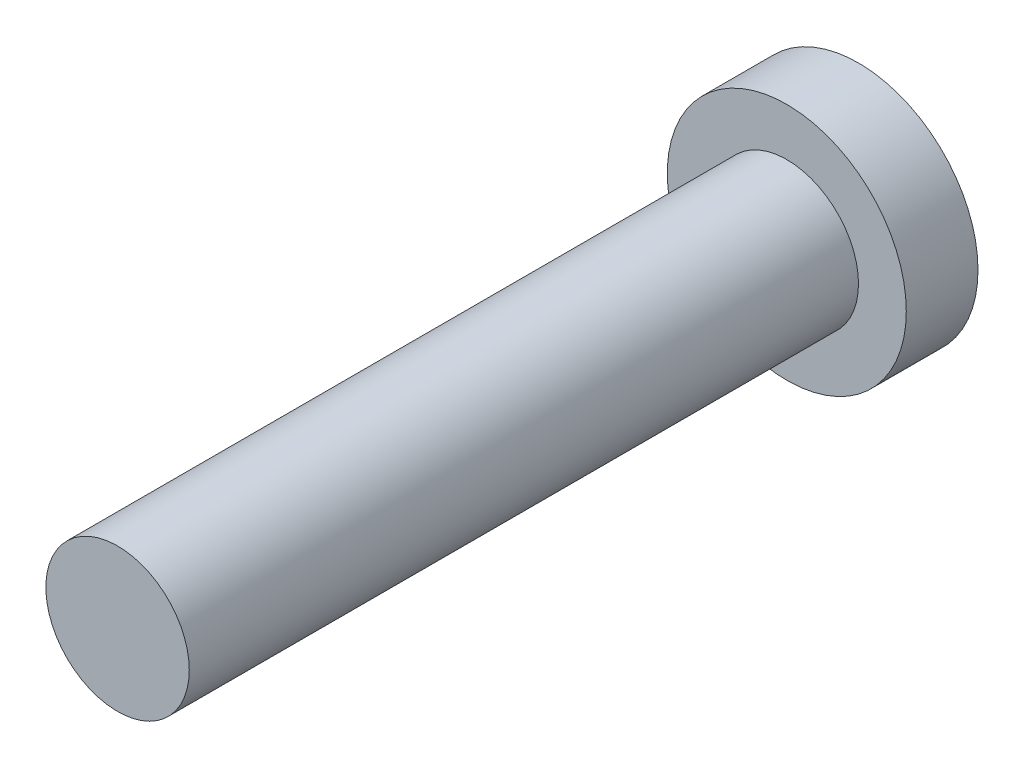
ISO-10303-21;
HEADER;
FILE_DESCRIPTION(('STEP AP214'),'2;1');
FILE_NAME('part.step','',(''),(''),'','','');
FILE_SCHEMA(('AUTOMOTIVE_DESIGN { 1 0 10303 214 1 1 1 1 }'));
ENDSEC;
DATA;
#1=APPLICATION_CONTEXT('core data for automotive mechanical design processes');
#2=APPLICATION_PROTOCOL_DEFINITION('international standard','automotive_design',2000,#1);
#3=PRODUCT_CONTEXT('',#1,'mechanical');
#4=PRODUCT('Part','Part','',(#3));
#5=PRODUCT_RELATED_PRODUCT_CATEGORY('part','',(#4));
#6=PRODUCT_DEFINITION_FORMATION('','',#4);
#7=PRODUCT_DEFINITION_CONTEXT('part definition',#1,'design');
#8=PRODUCT_DEFINITION('design','',#6,#7);
#9=PRODUCT_DEFINITION_SHAPE('','',#8);
#10=(LENGTH_UNIT() NAMED_UNIT(*) SI_UNIT(.MILLI.,.METRE.));
#11=(NAMED_UNIT(*) PLANE_ANGLE_UNIT() SI_UNIT($,.RADIAN.));
#12=(NAMED_UNIT(*) SI_UNIT($,.STERADIAN.) SOLID_ANGLE_UNIT());
#13=UNCERTAINTY_MEASURE_WITH_UNIT(LENGTH_MEASURE(1.E-05),#10,'distance_accuracy_value','');
#14=(GEOMETRIC_REPRESENTATION_CONTEXT(3) GLOBAL_UNCERTAINTY_ASSIGNED_CONTEXT((#13)) GLOBAL_UNIT_ASSIGNED_CONTEXT((#10,
#11,#12)) REPRESENTATION_CONTEXT('',''));
#15=CARTESIAN_POINT('',(0.,0.,0.));
#16=DIRECTION('',(0.,0.,1.));
#17=DIRECTION('',(1.,0.,0.));
#18=AXIS2_PLACEMENT_3D('',#15,#16,#17);
#19=CARTESIAN_POINT('',(0.,0.,1.5));
#20=DIRECTION('',(0.,0.,-1.));
#21=DIRECTION('',(-1.,0.,0.));
#22=AXIS2_PLACEMENT_3D('',#19,#20,#21);
#23=CYLINDRICAL_SURFACE('',#22,2.5);
#24=CARTESIAN_POINT('',(0.,0.,1.5));
#25=DIRECTION('',(0.,0.,1.));
#26=DIRECTION('',(1.,0.,0.));
#27=AXIS2_PLACEMENT_3D('',#24,#25,#26);
#28=CIRCLE('',#27,2.5);
#29=CARTESIAN_POINT('',(2.5,0.,1.5));
#30=VERTEX_POINT('',#29);
#31=EDGE_CURVE('E10',#30,#30,#28,.T.);
#32=ORIENTED_EDGE('',*,*,#31,.F.);
#33=EDGE_LOOP('',(#32));
#34=FACE_BOUND('',#33,.T.);
#35=CARTESIAN_POINT('',(0.,0.,0.));
#36=DIRECTION('',(0.,0.,1.));
#37=DIRECTION('',(1.,0.,0.));
#38=AXIS2_PLACEMENT_3D('',#35,#36,#37);
#39=CIRCLE('',#38,2.5);
#40=CARTESIAN_POINT('',(2.5,0.,0.));
#41=VERTEX_POINT('',#40);
#42=EDGE_CURVE('E34',#41,#41,#39,.T.);
#43=ORIENTED_EDGE('',*,*,#42,.T.);
#44=EDGE_LOOP('',(#43));
#45=FACE_BOUND('',#44,.T.);
#46=ADVANCED_FACE('F31',(#34,#45),#23,.T.);
#47=CARTESIAN_POINT('',(0.,0.,1.5));
#48=DIRECTION('',(0.,0.,1.));
#49=DIRECTION('',(1.,0.,0.));
#50=AXIS2_PLACEMENT_3D('',#47,#48,#49);
#51=PLANE('',#50);
#52=CARTESIAN_POINT('',(0.,0.,1.5));
#53=DIRECTION('',(0.,0.,1.));
#54=DIRECTION('',(1.,0.,0.));
#55=AXIS2_PLACEMENT_3D('',#52,#53,#54);
#56=CIRCLE('',#55,1.5);
#57=CARTESIAN_POINT('',(1.5,0.,1.5));
#58=VERTEX_POINT('',#57);
#59=EDGE_CURVE('E43',#58,#58,#56,.T.);
#60=ORIENTED_EDGE('',*,*,#59,.F.);
#61=EDGE_LOOP('',(#60));
#62=FACE_BOUND('',#61,.T.);
#63=ORIENTED_EDGE('',*,*,#31,.T.);
#64=EDGE_LOOP('',(#63));
#65=FACE_BOUND('',#64,.T.);
#66=ADVANCED_FACE('F58',(#62,#65),#51,.T.);
#67=CARTESIAN_POINT('',(0.,0.,0.));
#68=DIRECTION('',(0.,0.,1.));
#69=DIRECTION('',(1.,0.,0.));
#70=AXIS2_PLACEMENT_3D('',#67,#68,#69);
#71=PLANE('',#70);
#72=ORIENTED_EDGE('',*,*,#42,.F.);
#73=EDGE_LOOP('',(#72));
#74=FACE_BOUND('',#73,.T.);
#75=ADVANCED_FACE('F54',(#74),#71,.F.);
#76=CARTESIAN_POINT('',(0.,0.,15.5));
#77=DIRECTION('',(0.,0.,-1.));
#78=DIRECTION('',(-1.,0.,0.));
#79=AXIS2_PLACEMENT_3D('',#76,#77,#78);
#80=CYLINDRICAL_SURFACE('',#79,1.5);
#81=CARTESIAN_POINT('',(0.,0.,15.5));
#82=DIRECTION('',(0.,0.,1.));
#83=DIRECTION('',(1.,0.,0.));
#84=AXIS2_PLACEMENT_3D('',#81,#82,#83);
#85=CIRCLE('',#84,1.5);
#86=CARTESIAN_POINT('',(1.5,0.,15.5));
#87=VERTEX_POINT('',#86);
#88=EDGE_CURVE('E41',#87,#87,#85,.T.);
#89=ORIENTED_EDGE('',*,*,#88,.F.);
#90=EDGE_LOOP('',(#89));
#91=FACE_BOUND('',#90,.T.);
#92=ORIENTED_EDGE('',*,*,#59,.T.);
#93=EDGE_LOOP('',(#92));
#94=FACE_BOUND('',#93,.T.);
#95=ADVANCED_FACE('F51',(#91,#94),#80,.T.);
#96=CARTESIAN_POINT('',(0.,0.,15.5));
#97=DIRECTION('',(0.,0.,1.));
#98=DIRECTION('',(1.,0.,0.));
#99=AXIS2_PLACEMENT_3D('',#96,#97,#98);
#100=PLANE('',#99);
#101=ORIENTED_EDGE('',*,*,#88,.T.);
#102=EDGE_LOOP('',(#101));
#103=FACE_BOUND('',#102,.T.);
#104=ADVANCED_FACE('F49',(#103),#100,.T.);
#105=CLOSED_SHELL('',(#46,#66,#75,#95,#104));
#106=MANIFOLD_SOLID_BREP('B2',#105);
#107=ADVANCED_BREP_SHAPE_REPRESENTATION('',(#18,#106),#14);
#108=SHAPE_DEFINITION_REPRESENTATION(#9,#107);
ENDSEC;
END-ISO-10303-21;
